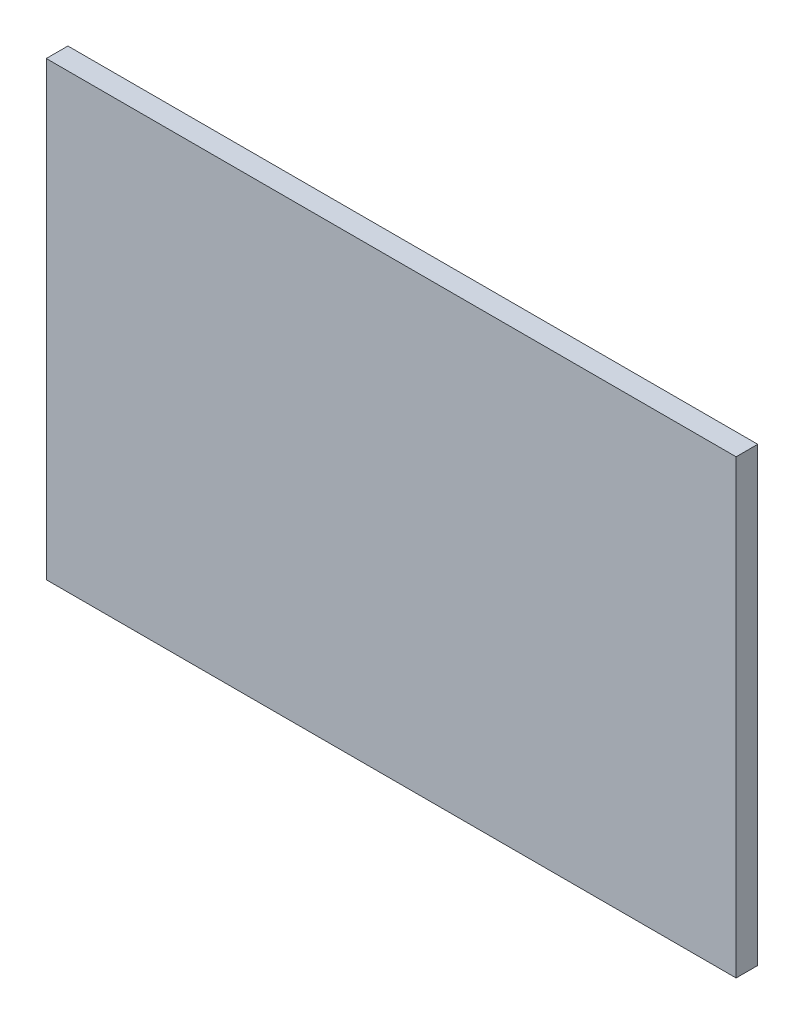
ISO-10303-21;
HEADER;
FILE_DESCRIPTION(('STEP AP214'),'2;1');
FILE_NAME('part.step','',(''),(''),'','','');
FILE_SCHEMA(('AUTOMOTIVE_DESIGN { 1 0 10303 214 1 1 1 1 }'));
ENDSEC;
DATA;
#1=APPLICATION_CONTEXT('core data for automotive mechanical design processes');
#2=APPLICATION_PROTOCOL_DEFINITION('international standard','automotive_design',2000,#1);
#3=PRODUCT_CONTEXT('',#1,'mechanical');
#4=PRODUCT('Part','Part','',(#3));
#5=PRODUCT_RELATED_PRODUCT_CATEGORY('part','',(#4));
#6=PRODUCT_DEFINITION_FORMATION('','',#4);
#7=PRODUCT_DEFINITION_CONTEXT('part definition',#1,'design');
#8=PRODUCT_DEFINITION('design','',#6,#7);
#9=PRODUCT_DEFINITION_SHAPE('','',#8);
#10=(LENGTH_UNIT() NAMED_UNIT(*) SI_UNIT(.MILLI.,.METRE.));
#11=(NAMED_UNIT(*) PLANE_ANGLE_UNIT() SI_UNIT($,.RADIAN.));
#12=(NAMED_UNIT(*) SI_UNIT($,.STERADIAN.) SOLID_ANGLE_UNIT());
#13=UNCERTAINTY_MEASURE_WITH_UNIT(LENGTH_MEASURE(1.E-05),#10,'distance_accuracy_value','');
#14=(GEOMETRIC_REPRESENTATION_CONTEXT(3) GLOBAL_UNCERTAINTY_ASSIGNED_CONTEXT((#13)) GLOBAL_UNIT_ASSIGNED_CONTEXT((#10,
#11,#12)) REPRESENTATION_CONTEXT('',''));
#15=CARTESIAN_POINT('',(0.,0.,0.));
#16=DIRECTION('',(0.,0.,1.));
#17=DIRECTION('',(1.,0.,0.));
#18=AXIS2_PLACEMENT_3D('',#15,#16,#17);
#19=CARTESIAN_POINT('',(-399.999999999999,-1.33226762955019E-12,-12.5));
#20=DIRECTION('',(-1.,0.,0.));
#21=DIRECTION('',(0.,0.,1.));
#22=AXIS2_PLACEMENT_3D('',#19,#20,#21);
#23=PLANE('',#22);
#24=DIRECTION('',(0.,-1.,0.));
#25=VECTOR('',#24,1.);
#26=CARTESIAN_POINT('',(-399.999999999999,-1.33226762955019E-12,0.));
#27=LINE('',#26,#25);
#28=CARTESIAN_POINT('',(-399.999999999999,-1.33226762955019E-12,0.));
#29=VERTEX_POINT('',#28);
#30=CARTESIAN_POINT('',(-399.999999999999,-260.75,0.));
#31=VERTEX_POINT('',#30);
#32=EDGE_CURVE('E99',#29,#31,#27,.T.);
#33=ORIENTED_EDGE('',*,*,#32,.F.);
#34=DIRECTION('',(0.,0.,1.));
#35=VECTOR('',#34,1.);
#36=CARTESIAN_POINT('',(-399.999999999999,-1.33226762955019E-12,-12.5));
#37=LINE('',#36,#35);
#38=CARTESIAN_POINT('',(-399.999999999999,-1.33226762955019E-12,-12.5));
#39=VERTEX_POINT('',#38);
#40=EDGE_CURVE('E11',#39,#29,#37,.T.);
#41=ORIENTED_EDGE('',*,*,#40,.F.);
#42=DIRECTION('',(0.,-1.,0.));
#43=VECTOR('',#42,1.);
#44=CARTESIAN_POINT('',(-399.999999999999,-1.33226762955019E-12,-12.5));
#45=LINE('',#44,#43);
#46=CARTESIAN_POINT('',(-399.999999999999,-260.75,-12.5));
#47=VERTEX_POINT('',#46);
#48=EDGE_CURVE('E93',#39,#47,#45,.T.);
#49=ORIENTED_EDGE('',*,*,#48,.T.);
#50=DIRECTION('',(0.,0.,1.));
#51=VECTOR('',#50,1.);
#52=CARTESIAN_POINT('',(-399.999999999999,-260.75,-12.5));
#53=LINE('',#52,#51);
#54=EDGE_CURVE('E38',#47,#31,#53,.T.);
#55=ORIENTED_EDGE('',*,*,#54,.T.);
#56=EDGE_LOOP('',(#33,#41,#49,#55));
#57=FACE_BOUND('',#56,.T.);
#58=ADVANCED_FACE('F35',(#57),#23,.T.);
#59=CARTESIAN_POINT('',(-399.999999999999,-1.33226762955019E-12,-12.5));
#60=DIRECTION('',(0.,1.,0.));
#61=DIRECTION('',(0.,0.,1.));
#62=AXIS2_PLACEMENT_3D('',#59,#60,#61);
#63=PLANE('',#62);
#64=DIRECTION('',(-1.,0.,0.));
#65=VECTOR('',#64,1.);
#66=CARTESIAN_POINT('',(-399.999999999999,-1.33226762955019E-12,0.));
#67=LINE('',#66,#65);
#68=CARTESIAN_POINT('',(-1.49999999999959,-1.33226762955019E-12,0.));
#69=VERTEX_POINT('',#68);
#70=EDGE_CURVE('E95',#69,#29,#67,.T.);
#71=ORIENTED_EDGE('',*,*,#70,.F.);
#72=DIRECTION('',(0.,0.,1.));
#73=VECTOR('',#72,1.);
#74=CARTESIAN_POINT('',(-1.49999999999959,-1.33226762955019E-12,-12.5));
#75=LINE('',#74,#73);
#76=CARTESIAN_POINT('',(-1.49999999999959,-1.33226762955019E-12,-12.5));
#77=VERTEX_POINT('',#76);
#78=EDGE_CURVE('E44',#77,#69,#75,.T.);
#79=ORIENTED_EDGE('',*,*,#78,.F.);
#80=DIRECTION('',(-1.,0.,0.));
#81=VECTOR('',#80,1.);
#82=CARTESIAN_POINT('',(-399.999999999999,-1.33226762955019E-12,-12.5));
#83=LINE('',#82,#81);
#84=EDGE_CURVE('E90',#77,#39,#83,.T.);
#85=ORIENTED_EDGE('',*,*,#84,.T.);
#86=ORIENTED_EDGE('',*,*,#40,.T.);
#87=EDGE_LOOP('',(#71,#79,#85,#86));
#88=FACE_BOUND('',#87,.T.);
#89=ADVANCED_FACE('F109',(#88),#63,.T.);
#90=CARTESIAN_POINT('',(-1.49999999999959,-1.33226762955019E-12,-12.5));
#91=DIRECTION('',(1.,0.,0.));
#92=DIRECTION('',(0.,0.,-1.));
#93=AXIS2_PLACEMENT_3D('',#90,#91,#92);
#94=PLANE('',#93);
#95=DIRECTION('',(0.,1.,0.));
#96=VECTOR('',#95,1.);
#97=CARTESIAN_POINT('',(-1.49999999999959,-1.33226762955019E-12,0.));
#98=LINE('',#97,#96);
#99=CARTESIAN_POINT('',(-1.49999999999959,-260.75,0.));
#100=VERTEX_POINT('',#99);
#101=EDGE_CURVE('E85',#100,#69,#98,.T.);
#102=ORIENTED_EDGE('',*,*,#101,.F.);
#103=DIRECTION('',(0.,0.,1.));
#104=VECTOR('',#103,1.);
#105=CARTESIAN_POINT('',(-1.49999999999959,-260.75,-12.5));
#106=LINE('',#105,#104);
#107=CARTESIAN_POINT('',(-1.49999999999959,-260.75,-12.5));
#108=VERTEX_POINT('',#107);
#109=EDGE_CURVE('E80',#108,#100,#106,.T.);
#110=ORIENTED_EDGE('',*,*,#109,.F.);
#111=DIRECTION('',(0.,1.,0.));
#112=VECTOR('',#111,1.);
#113=CARTESIAN_POINT('',(-1.49999999999959,-1.33226762955019E-12,-12.5));
#114=LINE('',#113,#112);
#115=EDGE_CURVE('E83',#108,#77,#114,.T.);
#116=ORIENTED_EDGE('',*,*,#115,.T.);
#117=ORIENTED_EDGE('',*,*,#78,.T.);
#118=EDGE_LOOP('',(#102,#110,#116,#117));
#119=FACE_BOUND('',#118,.T.);
#120=ADVANCED_FACE('F82',(#119),#94,.T.);
#121=CARTESIAN_POINT('',(-399.999999999999,-260.75,-12.5));
#122=DIRECTION('',(0.,-1.,0.));
#123=DIRECTION('',(0.,0.,-1.));
#124=AXIS2_PLACEMENT_3D('',#121,#122,#123);
#125=PLANE('',#124);
#126=DIRECTION('',(1.,0.,0.));
#127=VECTOR('',#126,1.);
#128=CARTESIAN_POINT('',(-399.999999999999,-260.75,0.));
#129=LINE('',#128,#127);
#130=EDGE_CURVE('E102',#31,#100,#129,.T.);
#131=ORIENTED_EDGE('',*,*,#130,.F.);
#132=ORIENTED_EDGE('',*,*,#54,.F.);
#133=DIRECTION('',(1.,0.,0.));
#134=VECTOR('',#133,1.);
#135=CARTESIAN_POINT('',(-399.999999999999,-260.75,-12.5));
#136=LINE('',#135,#134);
#137=EDGE_CURVE('E89',#47,#108,#136,.T.);
#138=ORIENTED_EDGE('',*,*,#137,.T.);
#139=ORIENTED_EDGE('',*,*,#109,.T.);
#140=EDGE_LOOP('',(#131,#132,#138,#139));
#141=FACE_BOUND('',#140,.T.);
#142=ADVANCED_FACE('F92',(#141),#125,.T.);
#143=CARTESIAN_POINT('',(0.,0.,-12.5));
#144=DIRECTION('',(0.,0.,1.));
#145=DIRECTION('',(1.,0.,0.));
#146=AXIS2_PLACEMENT_3D('',#143,#144,#145);
#147=PLANE('',#146);
#148=ORIENTED_EDGE('',*,*,#48,.F.);
#149=ORIENTED_EDGE('',*,*,#84,.F.);
#150=ORIENTED_EDGE('',*,*,#115,.F.);
#151=ORIENTED_EDGE('',*,*,#137,.F.);
#152=EDGE_LOOP('',(#148,#149,#150,#151));
#153=FACE_BOUND('',#152,.T.);
#154=ADVANCED_FACE('F88',(#153),#147,.F.);
#155=CARTESIAN_POINT('',(0.,0.,0.));
#156=DIRECTION('',(0.,0.,1.));
#157=DIRECTION('',(1.,0.,0.));
#158=AXIS2_PLACEMENT_3D('',#155,#156,#157);
#159=PLANE('',#158);
#160=ORIENTED_EDGE('',*,*,#32,.T.);
#161=ORIENTED_EDGE('',*,*,#130,.T.);
#162=ORIENTED_EDGE('',*,*,#101,.T.);
#163=ORIENTED_EDGE('',*,*,#70,.T.);
#164=EDGE_LOOP('',(#160,#161,#162,#163));
#165=FACE_BOUND('',#164,.T.);
#166=ADVANCED_FACE('F108',(#165),#159,.T.);
#167=CLOSED_SHELL('',(#58,#89,#120,#142,#154,#166));
#168=MANIFOLD_SOLID_BREP('B2',#167);
#169=ADVANCED_BREP_SHAPE_REPRESENTATION('',(#18,#168),#14);
#170=SHAPE_DEFINITION_REPRESENTATION(#9,#169);
ENDSEC;
END-ISO-10303-21;
